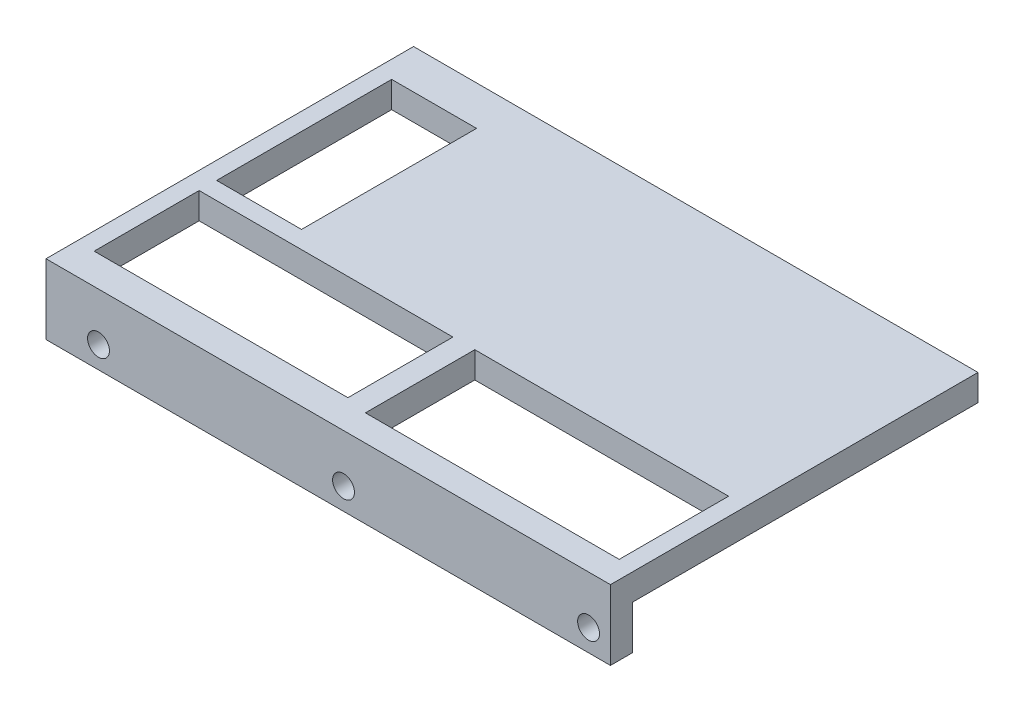
ISO-10303-21;
HEADER;
FILE_DESCRIPTION(('STEP AP214'),'2;1');
FILE_NAME('part.step','',(''),(''),'','','');
FILE_SCHEMA(('AUTOMOTIVE_DESIGN { 1 0 10303 214 1 1 1 1 }'));
ENDSEC;
DATA;
#1=APPLICATION_CONTEXT('core data for automotive mechanical design processes');
#2=APPLICATION_PROTOCOL_DEFINITION('international standard','automotive_design',2000,#1);
#3=PRODUCT_CONTEXT('',#1,'mechanical');
#4=PRODUCT('Part','Part','',(#3));
#5=PRODUCT_RELATED_PRODUCT_CATEGORY('part','',(#4));
#6=PRODUCT_DEFINITION_FORMATION('','',#4);
#7=PRODUCT_DEFINITION_CONTEXT('part definition',#1,'design');
#8=PRODUCT_DEFINITION('design','',#6,#7);
#9=PRODUCT_DEFINITION_SHAPE('','',#8);
#10=(LENGTH_UNIT() NAMED_UNIT(*) SI_UNIT(.MILLI.,.METRE.));
#11=(NAMED_UNIT(*) PLANE_ANGLE_UNIT() SI_UNIT($,.RADIAN.));
#12=(NAMED_UNIT(*) SI_UNIT($,.STERADIAN.) SOLID_ANGLE_UNIT());
#13=UNCERTAINTY_MEASURE_WITH_UNIT(LENGTH_MEASURE(1.E-05),#10,'distance_accuracy_value','');
#14=(GEOMETRIC_REPRESENTATION_CONTEXT(3) GLOBAL_UNCERTAINTY_ASSIGNED_CONTEXT((#13)) GLOBAL_UNIT_ASSIGNED_CONTEXT((#10,
#11,#12)) REPRESENTATION_CONTEXT('',''));
#15=CARTESIAN_POINT('',(0.,0.,0.));
#16=DIRECTION('',(0.,0.,1.));
#17=DIRECTION('',(1.,0.,0.));
#18=AXIS2_PLACEMENT_3D('',#15,#16,#17);
#19=CARTESIAN_POINT('',(0.,3.,0.));
#20=DIRECTION('',(1.,0.,0.));
#21=DIRECTION('',(0.,0.,-1.));
#22=AXIS2_PLACEMENT_3D('',#19,#20,#21);
#23=PLANE('',#22);
#24=DIRECTION('',(0.,0.,1.));
#25=VECTOR('',#24,1.);
#26=CARTESIAN_POINT('',(0.,0.,0.));
#27=LINE('',#26,#25);
#28=CARTESIAN_POINT('',(0.,0.,-42.));
#29=VERTEX_POINT('',#28);
#30=CARTESIAN_POINT('',(0.,0.,-2.5));
#31=VERTEX_POINT('',#30);
#32=EDGE_CURVE('E180',#29,#31,#27,.T.);
#33=ORIENTED_EDGE('',*,*,#32,.T.);
#34=DIRECTION('',(0.,1.,0.));
#35=VECTOR('',#34,1.);
#36=CARTESIAN_POINT('',(0.,-5.,-2.5));
#37=LINE('',#36,#35);
#38=CARTESIAN_POINT('',(0.,-5.,-2.5));
#39=VERTEX_POINT('',#38);
#40=EDGE_CURVE('E162',#39,#31,#37,.T.);
#41=ORIENTED_EDGE('',*,*,#40,.F.);
#42=DIRECTION('',(0.,0.,-1.));
#43=VECTOR('',#42,1.);
#44=CARTESIAN_POINT('',(0.,-5.,0.));
#45=LINE('',#44,#43);
#46=CARTESIAN_POINT('',(0.,-5.,0.));
#47=VERTEX_POINT('',#46);
#48=EDGE_CURVE('E169',#47,#39,#45,.T.);
#49=ORIENTED_EDGE('',*,*,#48,.F.);
#50=DIRECTION('',(0.,-1.,0.));
#51=VECTOR('',#50,1.);
#52=CARTESIAN_POINT('',(0.,3.,0.));
#53=LINE('',#52,#51);
#54=CARTESIAN_POINT('',(0.,3.,0.));
#55=VERTEX_POINT('',#54);
#56=EDGE_CURVE('E11',#55,#47,#53,.T.);
#57=ORIENTED_EDGE('',*,*,#56,.F.);
#58=DIRECTION('',(0.,0.,1.));
#59=VECTOR('',#58,1.);
#60=CARTESIAN_POINT('',(0.,3.,0.));
#61=LINE('',#60,#59);
#62=CARTESIAN_POINT('',(0.,3.,-42.));
#63=VERTEX_POINT('',#62);
#64=EDGE_CURVE('E279',#63,#55,#61,.T.);
#65=ORIENTED_EDGE('',*,*,#64,.F.);
#66=DIRECTION('',(0.,-1.,0.));
#67=VECTOR('',#66,1.);
#68=CARTESIAN_POINT('',(0.,3.,-42.));
#69=LINE('',#68,#67);
#70=EDGE_CURVE('E289',#63,#29,#69,.T.);
#71=ORIENTED_EDGE('',*,*,#70,.T.);
#72=EDGE_LOOP('',(#33,#41,#49,#57,#65,#71));
#73=FACE_BOUND('',#72,.T.);
#74=ADVANCED_FACE('F33',(#73),#23,.F.);
#75=CARTESIAN_POINT('',(0.,3.,0.));
#76=DIRECTION('',(0.,0.,-1.));
#77=DIRECTION('',(-1.,0.,0.));
#78=AXIS2_PLACEMENT_3D('',#75,#76,#77);
#79=PLANE('',#78);
#80=CARTESIAN_POINT('',(62.,-2.5,0.));
#81=DIRECTION('',(0.,0.,1.));
#82=DIRECTION('',(1.,0.,0.));
#83=AXIS2_PLACEMENT_3D('',#80,#81,#82);
#84=CIRCLE('',#83,1.25);
#85=CARTESIAN_POINT('',(63.25,-2.5,0.));
#86=VERTEX_POINT('',#85);
#87=EDGE_CURVE('E308',#86,#86,#84,.T.);
#88=ORIENTED_EDGE('',*,*,#87,.F.);
#89=EDGE_LOOP('',(#88));
#90=FACE_BOUND('',#89,.T.);
#91=CARTESIAN_POINT('',(6.,-2.5,0.));
#92=DIRECTION('',(0.,0.,1.));
#93=DIRECTION('',(1.,0.,0.));
#94=AXIS2_PLACEMENT_3D('',#91,#92,#93);
#95=CIRCLE('',#94,1.25);
#96=CARTESIAN_POINT('',(7.25,-2.5,0.));
#97=VERTEX_POINT('',#96);
#98=EDGE_CURVE('E316',#97,#97,#95,.T.);
#99=ORIENTED_EDGE('',*,*,#98,.F.);
#100=EDGE_LOOP('',(#99));
#101=FACE_BOUND('',#100,.T.);
#102=CARTESIAN_POINT('',(34.,-2.5,0.));
#103=DIRECTION('',(0.,0.,1.));
#104=DIRECTION('',(1.,0.,0.));
#105=AXIS2_PLACEMENT_3D('',#102,#103,#104);
#106=CIRCLE('',#105,1.25);
#107=CARTESIAN_POINT('',(35.25,-2.5,0.));
#108=VERTEX_POINT('',#107);
#109=EDGE_CURVE('E322',#108,#108,#106,.T.);
#110=ORIENTED_EDGE('',*,*,#109,.F.);
#111=EDGE_LOOP('',(#110));
#112=FACE_BOUND('',#111,.T.);
#113=ORIENTED_EDGE('',*,*,#56,.T.);
#114=DIRECTION('',(-1.,0.,0.));
#115=VECTOR('',#114,1.);
#116=CARTESIAN_POINT('',(0.,-5.,0.));
#117=LINE('',#116,#115);
#118=CARTESIAN_POINT('',(64.5,-5.,0.));
#119=VERTEX_POINT('',#118);
#120=EDGE_CURVE('E175',#119,#47,#117,.T.);
#121=ORIENTED_EDGE('',*,*,#120,.F.);
#122=DIRECTION('',(0.,-1.,0.));
#123=VECTOR('',#122,1.);
#124=CARTESIAN_POINT('',(64.5,3.,0.));
#125=LINE('',#124,#123);
#126=CARTESIAN_POINT('',(64.5,3.,0.));
#127=VERTEX_POINT('',#126);
#128=EDGE_CURVE('E40',#127,#119,#125,.T.);
#129=ORIENTED_EDGE('',*,*,#128,.F.);
#130=DIRECTION('',(1.,0.,0.));
#131=VECTOR('',#130,1.);
#132=CARTESIAN_POINT('',(0.,3.,0.));
#133=LINE('',#132,#131);
#134=EDGE_CURVE('E282',#55,#127,#133,.T.);
#135=ORIENTED_EDGE('',*,*,#134,.F.);
#136=EDGE_LOOP('',(#113,#121,#129,#135));
#137=FACE_BOUND('',#136,.T.);
#138=ADVANCED_FACE('F304',(#90,#101,#112,#137),#79,.F.);
#139=CARTESIAN_POINT('',(64.5,3.,0.));
#140=DIRECTION('',(-1.,0.,0.));
#141=DIRECTION('',(0.,0.,1.));
#142=AXIS2_PLACEMENT_3D('',#139,#140,#141);
#143=PLANE('',#142);
#144=ORIENTED_EDGE('',*,*,#128,.T.);
#145=DIRECTION('',(0.,0.,1.));
#146=VECTOR('',#145,1.);
#147=CARTESIAN_POINT('',(64.5,-5.,0.));
#148=LINE('',#147,#146);
#149=CARTESIAN_POINT('',(64.5,-5.,-2.5));
#150=VERTEX_POINT('',#149);
#151=EDGE_CURVE('E168',#150,#119,#148,.T.);
#152=ORIENTED_EDGE('',*,*,#151,.F.);
#153=DIRECTION('',(0.,1.,0.));
#154=VECTOR('',#153,1.);
#155=CARTESIAN_POINT('',(64.5,-5.,-2.5));
#156=LINE('',#155,#154);
#157=CARTESIAN_POINT('',(64.5,0.,-2.5));
#158=VERTEX_POINT('',#157);
#159=EDGE_CURVE('E164',#150,#158,#156,.T.);
#160=ORIENTED_EDGE('',*,*,#159,.T.);
#161=DIRECTION('',(0.,0.,-1.));
#162=VECTOR('',#161,1.);
#163=CARTESIAN_POINT('',(64.5,0.,0.));
#164=LINE('',#163,#162);
#165=CARTESIAN_POINT('',(64.5,0.,-42.));
#166=VERTEX_POINT('',#165);
#167=EDGE_CURVE('E291',#158,#166,#164,.T.);
#168=ORIENTED_EDGE('',*,*,#167,.T.);
#169=DIRECTION('',(0.,-1.,0.));
#170=VECTOR('',#169,1.);
#171=CARTESIAN_POINT('',(64.5,3.,-42.));
#172=LINE('',#171,#170);
#173=CARTESIAN_POINT('',(64.5,3.,-42.));
#174=VERTEX_POINT('',#173);
#175=EDGE_CURVE('E295',#174,#166,#172,.T.);
#176=ORIENTED_EDGE('',*,*,#175,.F.);
#177=DIRECTION('',(0.,0.,-1.));
#178=VECTOR('',#177,1.);
#179=CARTESIAN_POINT('',(64.5,3.,0.));
#180=LINE('',#179,#178);
#181=EDGE_CURVE('E285',#127,#174,#180,.T.);
#182=ORIENTED_EDGE('',*,*,#181,.F.);
#183=EDGE_LOOP('',(#144,#152,#160,#168,#176,#182));
#184=FACE_BOUND('',#183,.T.);
#185=ADVANCED_FACE('F300',(#184),#143,.F.);
#186=CARTESIAN_POINT('',(0.,3.,-42.));
#187=DIRECTION('',(0.,0.,1.));
#188=DIRECTION('',(1.,0.,0.));
#189=AXIS2_PLACEMENT_3D('',#186,#187,#188);
#190=PLANE('',#189);
#191=DIRECTION('',(-1.,0.,0.));
#192=VECTOR('',#191,1.);
#193=CARTESIAN_POINT('',(0.,0.,-42.));
#194=LINE('',#193,#192);
#195=EDGE_CURVE('E283',#166,#29,#194,.T.);
#196=ORIENTED_EDGE('',*,*,#195,.T.);
#197=ORIENTED_EDGE('',*,*,#70,.F.);
#198=DIRECTION('',(-1.,0.,0.));
#199=VECTOR('',#198,1.);
#200=CARTESIAN_POINT('',(0.,3.,-42.));
#201=LINE('',#200,#199);
#202=EDGE_CURVE('E287',#174,#63,#201,.T.);
#203=ORIENTED_EDGE('',*,*,#202,.F.);
#204=ORIENTED_EDGE('',*,*,#175,.T.);
#205=EDGE_LOOP('',(#196,#197,#203,#204));
#206=FACE_BOUND('',#205,.T.);
#207=ADVANCED_FACE('F352',(#206),#190,.F.);
#208=CARTESIAN_POINT('',(0.,3.,0.));
#209=DIRECTION('',(0.,-1.,0.));
#210=DIRECTION('',(0.,0.,-1.));
#211=AXIS2_PLACEMENT_3D('',#208,#209,#210);
#212=PLANE('',#211);
#213=DIRECTION('',(-1.,0.,0.));
#214=VECTOR('',#213,1.);
#215=CARTESIAN_POINT('',(62.5,3.,-15.5));
#216=LINE('',#215,#214);
#217=CARTESIAN_POINT('',(62.5,3.,-15.5));
#218=VERTEX_POINT('',#217);
#219=CARTESIAN_POINT('',(33.5,3.,-15.5));
#220=VERTEX_POINT('',#219);
#221=EDGE_CURVE('E200',#218,#220,#216,.T.);
#222=ORIENTED_EDGE('',*,*,#221,.F.);
#223=DIRECTION('',(0.,0.,-1.));
#224=VECTOR('',#223,1.);
#225=CARTESIAN_POINT('',(62.5,3.,-3.00000000000001));
#226=LINE('',#225,#224);
#227=CARTESIAN_POINT('',(62.5,3.,-3.00000000000001));
#228=VERTEX_POINT('',#227);
#229=EDGE_CURVE('E55',#228,#218,#226,.T.);
#230=ORIENTED_EDGE('',*,*,#229,.F.);
#231=DIRECTION('',(1.,0.,0.));
#232=VECTOR('',#231,1.);
#233=CARTESIAN_POINT('',(62.5,3.,-3.00000000000001));
#234=LINE('',#233,#232);
#235=CARTESIAN_POINT('',(33.5,3.,-3.));
#236=VERTEX_POINT('',#235);
#237=EDGE_CURVE('E206',#236,#228,#234,.T.);
#238=ORIENTED_EDGE('',*,*,#237,.F.);
#239=DIRECTION('',(0.,0.,1.));
#240=VECTOR('',#239,1.);
#241=CARTESIAN_POINT('',(33.5,3.,-3.));
#242=LINE('',#241,#240);
#243=EDGE_CURVE('E203',#220,#236,#242,.T.);
#244=ORIENTED_EDGE('',*,*,#243,.F.);
#245=EDGE_LOOP('',(#222,#230,#238,#244));
#246=FACE_BOUND('',#245,.T.);
#247=DIRECTION('',(-1.,0.,0.));
#248=VECTOR('',#247,1.);
#249=CARTESIAN_POINT('',(31.,3.,-15.5));
#250=LINE('',#249,#248);
#251=CARTESIAN_POINT('',(31.,3.,-15.5));
#252=VERTEX_POINT('',#251);
#253=CARTESIAN_POINT('',(1.99999999999995,3.,-15.5));
#254=VERTEX_POINT('',#253);
#255=EDGE_CURVE('E232',#252,#254,#250,.T.);
#256=ORIENTED_EDGE('',*,*,#255,.F.);
#257=DIRECTION('',(0.,0.,-1.));
#258=VECTOR('',#257,1.);
#259=CARTESIAN_POINT('',(31.,3.,-3.5));
#260=LINE('',#259,#258);
#261=CARTESIAN_POINT('',(31.,3.,-3.5));
#262=VERTEX_POINT('',#261);
#263=EDGE_CURVE('E230',#262,#252,#260,.T.);
#264=ORIENTED_EDGE('',*,*,#263,.F.);
#265=DIRECTION('',(1.,0.,0.));
#266=VECTOR('',#265,1.);
#267=CARTESIAN_POINT('',(31.,3.,-3.5));
#268=LINE('',#267,#266);
#269=CARTESIAN_POINT('',(1.99999999999995,3.,-3.5));
#270=VERTEX_POINT('',#269);
#271=EDGE_CURVE('E238',#270,#262,#268,.T.);
#272=ORIENTED_EDGE('',*,*,#271,.F.);
#273=DIRECTION('',(0.,0.,1.));
#274=VECTOR('',#273,1.);
#275=CARTESIAN_POINT('',(1.99999999999995,3.,-3.5));
#276=LINE('',#275,#274);
#277=EDGE_CURVE('E235',#254,#270,#276,.T.);
#278=ORIENTED_EDGE('',*,*,#277,.F.);
#279=EDGE_LOOP('',(#256,#264,#272,#278));
#280=FACE_BOUND('',#279,.T.);
#281=DIRECTION('',(-1.,0.,0.));
#282=VECTOR('',#281,1.);
#283=CARTESIAN_POINT('',(11.7,3.,-37.5));
#284=LINE('',#283,#282);
#285=CARTESIAN_POINT('',(11.7,3.,-37.5));
#286=VERTEX_POINT('',#285);
#287=CARTESIAN_POINT('',(1.99999999999994,3.,-37.5));
#288=VERTEX_POINT('',#287);
#289=EDGE_CURVE('E259',#286,#288,#284,.T.);
#290=ORIENTED_EDGE('',*,*,#289,.F.);
#291=DIRECTION('',(0.,0.,-1.));
#292=VECTOR('',#291,1.);
#293=CARTESIAN_POINT('',(11.7,3.,-17.5));
#294=LINE('',#293,#292);
#295=CARTESIAN_POINT('',(11.7,3.,-17.5));
#296=VERTEX_POINT('',#295);
#297=EDGE_CURVE('E257',#296,#286,#294,.T.);
#298=ORIENTED_EDGE('',*,*,#297,.F.);
#299=DIRECTION('',(1.,0.,0.));
#300=VECTOR('',#299,1.);
#301=CARTESIAN_POINT('',(11.7,3.,-17.5));
#302=LINE('',#301,#300);
#303=CARTESIAN_POINT('',(1.99999999999995,3.,-17.5));
#304=VERTEX_POINT('',#303);
#305=EDGE_CURVE('E265',#304,#296,#302,.T.);
#306=ORIENTED_EDGE('',*,*,#305,.F.);
#307=DIRECTION('',(0.,0.,1.));
#308=VECTOR('',#307,1.);
#309=CARTESIAN_POINT('',(1.99999999999995,3.,-17.5));
#310=LINE('',#309,#308);
#311=EDGE_CURVE('E262',#288,#304,#310,.T.);
#312=ORIENTED_EDGE('',*,*,#311,.F.);
#313=EDGE_LOOP('',(#290,#298,#306,#312));
#314=FACE_BOUND('',#313,.T.);
#315=ORIENTED_EDGE('',*,*,#64,.T.);
#316=ORIENTED_EDGE('',*,*,#134,.T.);
#317=ORIENTED_EDGE('',*,*,#181,.T.);
#318=ORIENTED_EDGE('',*,*,#202,.T.);
#319=EDGE_LOOP('',(#315,#316,#317,#318));
#320=FACE_BOUND('',#319,.T.);
#321=ADVANCED_FACE('F359',(#246,#280,#314,#320),#212,.F.);
#322=CARTESIAN_POINT('',(0.,0.,0.));
#323=DIRECTION('',(0.,-1.,0.));
#324=DIRECTION('',(0.,0.,-1.));
#325=AXIS2_PLACEMENT_3D('',#322,#323,#324);
#326=PLANE('',#325);
#327=DIRECTION('',(1.,0.,0.));
#328=VECTOR('',#327,1.);
#329=CARTESIAN_POINT('',(0.,0.,-2.5));
#330=LINE('',#329,#328);
#331=EDGE_CURVE('E47',#31,#158,#330,.T.);
#332=ORIENTED_EDGE('',*,*,#331,.F.);
#333=ORIENTED_EDGE('',*,*,#32,.F.);
#334=ORIENTED_EDGE('',*,*,#195,.F.);
#335=ORIENTED_EDGE('',*,*,#167,.F.);
#336=EDGE_LOOP('',(#332,#333,#334,#335));
#337=FACE_BOUND('',#336,.T.);
#338=DIRECTION('',(0.,0.,-1.));
#339=VECTOR('',#338,1.);
#340=CARTESIAN_POINT('',(62.5,0.,-3.00000000000001));
#341=LINE('',#340,#339);
#342=CARTESIAN_POINT('',(62.5,0.,-3.00000000000001));
#343=VERTEX_POINT('',#342);
#344=CARTESIAN_POINT('',(62.5,0.,-15.5));
#345=VERTEX_POINT('',#344);
#346=EDGE_CURVE('E196',#343,#345,#341,.T.);
#347=ORIENTED_EDGE('',*,*,#346,.T.);
#348=DIRECTION('',(-1.,0.,0.));
#349=VECTOR('',#348,1.);
#350=CARTESIAN_POINT('',(62.5,0.,-15.5));
#351=LINE('',#350,#349);
#352=CARTESIAN_POINT('',(33.5,0.,-15.5));
#353=VERTEX_POINT('',#352);
#354=EDGE_CURVE('E212',#345,#353,#351,.T.);
#355=ORIENTED_EDGE('',*,*,#354,.T.);
#356=DIRECTION('',(0.,0.,1.));
#357=VECTOR('',#356,1.);
#358=CARTESIAN_POINT('',(33.5,0.,-3.));
#359=LINE('',#358,#357);
#360=CARTESIAN_POINT('',(33.5,0.,-3.));
#361=VERTEX_POINT('',#360);
#362=EDGE_CURVE('E189',#353,#361,#359,.T.);
#363=ORIENTED_EDGE('',*,*,#362,.T.);
#364=DIRECTION('',(1.,0.,0.));
#365=VECTOR('',#364,1.);
#366=CARTESIAN_POINT('',(62.5,0.,-3.00000000000001));
#367=LINE('',#366,#365);
#368=EDGE_CURVE('E192',#361,#343,#367,.T.);
#369=ORIENTED_EDGE('',*,*,#368,.T.);
#370=EDGE_LOOP('',(#347,#355,#363,#369));
#371=FACE_BOUND('',#370,.T.);
#372=DIRECTION('',(0.,0.,-1.));
#373=VECTOR('',#372,1.);
#374=CARTESIAN_POINT('',(31.,0.,-3.5));
#375=LINE('',#374,#373);
#376=CARTESIAN_POINT('',(31.,0.,-3.5));
#377=VERTEX_POINT('',#376);
#378=CARTESIAN_POINT('',(31.,0.,-15.5));
#379=VERTEX_POINT('',#378);
#380=EDGE_CURVE('E227',#377,#379,#375,.T.);
#381=ORIENTED_EDGE('',*,*,#380,.T.);
#382=DIRECTION('',(-1.,0.,0.));
#383=VECTOR('',#382,1.);
#384=CARTESIAN_POINT('',(31.,0.,-15.5));
#385=LINE('',#384,#383);
#386=CARTESIAN_POINT('',(1.99999999999995,0.,-15.5));
#387=VERTEX_POINT('',#386);
#388=EDGE_CURVE('E193',#379,#387,#385,.T.);
#389=ORIENTED_EDGE('',*,*,#388,.T.);
#390=DIRECTION('',(0.,0.,1.));
#391=VECTOR('',#390,1.);
#392=CARTESIAN_POINT('',(1.99999999999995,0.,-3.5));
#393=LINE('',#392,#391);
#394=CARTESIAN_POINT('',(1.99999999999995,0.,-3.5));
#395=VERTEX_POINT('',#394);
#396=EDGE_CURVE('E220',#387,#395,#393,.T.);
#397=ORIENTED_EDGE('',*,*,#396,.T.);
#398=DIRECTION('',(1.,0.,0.));
#399=VECTOR('',#398,1.);
#400=CARTESIAN_POINT('',(31.,0.,-3.5));
#401=LINE('',#400,#399);
#402=EDGE_CURVE('E223',#395,#377,#401,.T.);
#403=ORIENTED_EDGE('',*,*,#402,.T.);
#404=EDGE_LOOP('',(#381,#389,#397,#403));
#405=FACE_BOUND('',#404,.T.);
#406=DIRECTION('',(0.,0.,-1.));
#407=VECTOR('',#406,1.);
#408=CARTESIAN_POINT('',(11.7,0.,-17.5));
#409=LINE('',#408,#407);
#410=CARTESIAN_POINT('',(11.7,0.,-17.5));
#411=VERTEX_POINT('',#410);
#412=CARTESIAN_POINT('',(11.7,0.,-37.5));
#413=VERTEX_POINT('',#412);
#414=EDGE_CURVE('E254',#411,#413,#409,.T.);
#415=ORIENTED_EDGE('',*,*,#414,.T.);
#416=DIRECTION('',(-1.,0.,0.));
#417=VECTOR('',#416,1.);
#418=CARTESIAN_POINT('',(11.7,0.,-37.5));
#419=LINE('',#418,#417);
#420=CARTESIAN_POINT('',(1.99999999999994,0.,-37.5));
#421=VERTEX_POINT('',#420);
#422=EDGE_CURVE('E224',#413,#421,#419,.T.);
#423=ORIENTED_EDGE('',*,*,#422,.T.);
#424=DIRECTION('',(0.,0.,1.));
#425=VECTOR('',#424,1.);
#426=CARTESIAN_POINT('',(1.99999999999995,0.,-17.5));
#427=LINE('',#426,#425);
#428=CARTESIAN_POINT('',(1.99999999999995,0.,-17.5));
#429=VERTEX_POINT('',#428);
#430=EDGE_CURVE('E181',#421,#429,#427,.T.);
#431=ORIENTED_EDGE('',*,*,#430,.T.);
#432=DIRECTION('',(1.,0.,0.));
#433=VECTOR('',#432,1.);
#434=CARTESIAN_POINT('',(11.7,0.,-17.5));
#435=LINE('',#434,#433);
#436=EDGE_CURVE('E184',#429,#411,#435,.T.);
#437=ORIENTED_EDGE('',*,*,#436,.T.);
#438=EDGE_LOOP('',(#415,#423,#431,#437));
#439=FACE_BOUND('',#438,.T.);
#440=ADVANCED_FACE('F361',(#337,#371,#405,#439),#326,.T.);
#441=CARTESIAN_POINT('',(11.7,-0.00100000000000013,-17.5));
#442=DIRECTION('',(1.,0.,0.));
#443=DIRECTION('',(0.,0.,-1.));
#444=AXIS2_PLACEMENT_3D('',#441,#442,#443);
#445=PLANE('',#444);
#446=DIRECTION('',(0.,1.,0.));
#447=VECTOR('',#446,1.);
#448=CARTESIAN_POINT('',(11.7,-0.00100000000000013,-17.5));
#449=LINE('',#448,#447);
#450=EDGE_CURVE('E269',#411,#296,#449,.T.);
#451=ORIENTED_EDGE('',*,*,#450,.T.);
#452=ORIENTED_EDGE('',*,*,#297,.T.);
#453=DIRECTION('',(0.,1.,0.));
#454=VECTOR('',#453,1.);
#455=CARTESIAN_POINT('',(11.7,-0.00100000000000013,-37.5));
#456=LINE('',#455,#454);
#457=EDGE_CURVE('E268',#413,#286,#456,.T.);
#458=ORIENTED_EDGE('',*,*,#457,.F.);
#459=ORIENTED_EDGE('',*,*,#414,.F.);
#460=EDGE_LOOP('',(#451,#452,#458,#459));
#461=FACE_BOUND('',#460,.T.);
#462=ADVANCED_FACE('F364',(#461),#445,.F.);
#463=CARTESIAN_POINT('',(11.7,-0.00100000000000013,-17.5));
#464=DIRECTION('',(0.,0.,1.));
#465=DIRECTION('',(1.,0.,0.));
#466=AXIS2_PLACEMENT_3D('',#463,#464,#465);
#467=PLANE('',#466);
#468=DIRECTION('',(0.,1.,0.));
#469=VECTOR('',#468,1.);
#470=CARTESIAN_POINT('',(1.99999999999995,-0.00100000000000013,-17.5));
#471=LINE('',#470,#469);
#472=EDGE_CURVE('E271',#429,#304,#471,.T.);
#473=ORIENTED_EDGE('',*,*,#472,.T.);
#474=ORIENTED_EDGE('',*,*,#305,.T.);
#475=ORIENTED_EDGE('',*,*,#450,.F.);
#476=ORIENTED_EDGE('',*,*,#436,.F.);
#477=EDGE_LOOP('',(#473,#474,#475,#476));
#478=FACE_BOUND('',#477,.T.);
#479=ADVANCED_FACE('F370',(#478),#467,.F.);
#480=CARTESIAN_POINT('',(1.99999999999995,-0.00100000000000013,-17.5));
#481=DIRECTION('',(-1.,0.,0.));
#482=DIRECTION('',(0.,0.,1.));
#483=AXIS2_PLACEMENT_3D('',#480,#481,#482);
#484=PLANE('',#483);
#485=DIRECTION('',(0.,1.,0.));
#486=VECTOR('',#485,1.);
#487=CARTESIAN_POINT('',(1.99999999999994,-0.00100000000000013,-37.5));
#488=LINE('',#487,#486);
#489=EDGE_CURVE('E273',#421,#288,#488,.T.);
#490=ORIENTED_EDGE('',*,*,#489,.T.);
#491=ORIENTED_EDGE('',*,*,#311,.T.);
#492=ORIENTED_EDGE('',*,*,#472,.F.);
#493=ORIENTED_EDGE('',*,*,#430,.F.);
#494=EDGE_LOOP('',(#490,#491,#492,#493));
#495=FACE_BOUND('',#494,.T.);
#496=ADVANCED_FACE('F376',(#495),#484,.F.);
#497=CARTESIAN_POINT('',(11.7,-0.00100000000000013,-37.5));
#498=DIRECTION('',(0.,0.,-1.));
#499=DIRECTION('',(-1.,0.,0.));
#500=AXIS2_PLACEMENT_3D('',#497,#498,#499);
#501=PLANE('',#500);
#502=ORIENTED_EDGE('',*,*,#457,.T.);
#503=ORIENTED_EDGE('',*,*,#289,.T.);
#504=ORIENTED_EDGE('',*,*,#489,.F.);
#505=ORIENTED_EDGE('',*,*,#422,.F.);
#506=EDGE_LOOP('',(#502,#503,#504,#505));
#507=FACE_BOUND('',#506,.T.);
#508=ADVANCED_FACE('F372',(#507),#501,.F.);
#509=CARTESIAN_POINT('',(31.,-0.00100000000000013,-3.5));
#510=DIRECTION('',(1.,0.,0.));
#511=DIRECTION('',(0.,0.,-1.));
#512=AXIS2_PLACEMENT_3D('',#509,#510,#511);
#513=PLANE('',#512);
#514=DIRECTION('',(0.,1.,0.));
#515=VECTOR('',#514,1.);
#516=CARTESIAN_POINT('',(31.,-0.00100000000000013,-3.5));
#517=LINE('',#516,#515);
#518=EDGE_CURVE('E242',#377,#262,#517,.T.);
#519=ORIENTED_EDGE('',*,*,#518,.T.);
#520=ORIENTED_EDGE('',*,*,#263,.T.);
#521=DIRECTION('',(0.,1.,0.));
#522=VECTOR('',#521,1.);
#523=CARTESIAN_POINT('',(31.,-0.00100000000000013,-15.5));
#524=LINE('',#523,#522);
#525=EDGE_CURVE('E241',#379,#252,#524,.T.);
#526=ORIENTED_EDGE('',*,*,#525,.F.);
#527=ORIENTED_EDGE('',*,*,#380,.F.);
#528=EDGE_LOOP('',(#519,#520,#526,#527));
#529=FACE_BOUND('',#528,.T.);
#530=ADVANCED_FACE('F375',(#529),#513,.F.);
#531=CARTESIAN_POINT('',(31.,-0.00100000000000013,-3.5));
#532=DIRECTION('',(0.,0.,1.));
#533=DIRECTION('',(1.,0.,0.));
#534=AXIS2_PLACEMENT_3D('',#531,#532,#533);
#535=PLANE('',#534);
#536=DIRECTION('',(0.,1.,0.));
#537=VECTOR('',#536,1.);
#538=CARTESIAN_POINT('',(1.99999999999995,-0.00100000000000013,-3.5));
#539=LINE('',#538,#537);
#540=EDGE_CURVE('E244',#395,#270,#539,.T.);
#541=ORIENTED_EDGE('',*,*,#540,.T.);
#542=ORIENTED_EDGE('',*,*,#271,.T.);
#543=ORIENTED_EDGE('',*,*,#518,.F.);
#544=ORIENTED_EDGE('',*,*,#402,.F.);
#545=EDGE_LOOP('',(#541,#542,#543,#544));
#546=FACE_BOUND('',#545,.T.);
#547=ADVANCED_FACE('F386',(#546),#535,.F.);
#548=CARTESIAN_POINT('',(1.99999999999995,-0.00100000000000013,-3.5));
#549=DIRECTION('',(-1.,0.,0.));
#550=DIRECTION('',(0.,0.,1.));
#551=AXIS2_PLACEMENT_3D('',#548,#549,#550);
#552=PLANE('',#551);
#553=DIRECTION('',(0.,1.,0.));
#554=VECTOR('',#553,1.);
#555=CARTESIAN_POINT('',(1.99999999999995,-0.00100000000000013,-15.5));
#556=LINE('',#555,#554);
#557=EDGE_CURVE('E246',#387,#254,#556,.T.);
#558=ORIENTED_EDGE('',*,*,#557,.T.);
#559=ORIENTED_EDGE('',*,*,#277,.T.);
#560=ORIENTED_EDGE('',*,*,#540,.F.);
#561=ORIENTED_EDGE('',*,*,#396,.F.);
#562=EDGE_LOOP('',(#558,#559,#560,#561));
#563=FACE_BOUND('',#562,.T.);
#564=ADVANCED_FACE('F392',(#563),#552,.F.);
#565=CARTESIAN_POINT('',(31.,-0.00100000000000013,-15.5));
#566=DIRECTION('',(0.,0.,-1.));
#567=DIRECTION('',(-1.,0.,0.));
#568=AXIS2_PLACEMENT_3D('',#565,#566,#567);
#569=PLANE('',#568);
#570=ORIENTED_EDGE('',*,*,#525,.T.);
#571=ORIENTED_EDGE('',*,*,#255,.T.);
#572=ORIENTED_EDGE('',*,*,#557,.F.);
#573=ORIENTED_EDGE('',*,*,#388,.F.);
#574=EDGE_LOOP('',(#570,#571,#572,#573));
#575=FACE_BOUND('',#574,.T.);
#576=ADVANCED_FACE('F388',(#575),#569,.F.);
#577=CARTESIAN_POINT('',(62.5,-0.00100000000000013,-3.00000000000001));
#578=DIRECTION('',(1.,0.,0.));
#579=DIRECTION('',(0.,0.,-1.));
#580=AXIS2_PLACEMENT_3D('',#577,#578,#579);
#581=PLANE('',#580);
#582=DIRECTION('',(0.,1.,0.));
#583=VECTOR('',#582,1.);
#584=CARTESIAN_POINT('',(62.5,-0.00100000000000013,-3.00000000000001));
#585=LINE('',#584,#583);
#586=EDGE_CURVE('E210',#343,#228,#585,.T.);
#587=ORIENTED_EDGE('',*,*,#586,.T.);
#588=ORIENTED_EDGE('',*,*,#229,.T.);
#589=DIRECTION('',(0.,1.,0.));
#590=VECTOR('',#589,1.);
#591=CARTESIAN_POINT('',(62.5,-0.00100000000000013,-15.5));
#592=LINE('',#591,#590);
#593=EDGE_CURVE('E209',#345,#218,#592,.T.);
#594=ORIENTED_EDGE('',*,*,#593,.F.);
#595=ORIENTED_EDGE('',*,*,#346,.F.);
#596=EDGE_LOOP('',(#587,#588,#594,#595));
#597=FACE_BOUND('',#596,.T.);
#598=ADVANCED_FACE('F391',(#597),#581,.F.);
#599=CARTESIAN_POINT('',(62.5,-0.00100000000000013,-3.00000000000001));
#600=DIRECTION('',(0.,0.,1.));
#601=DIRECTION('',(1.,0.,0.));
#602=AXIS2_PLACEMENT_3D('',#599,#600,#601);
#603=PLANE('',#602);
#604=DIRECTION('',(0.,1.,0.));
#605=VECTOR('',#604,1.);
#606=CARTESIAN_POINT('',(33.5,-0.00100000000000013,-3.));
#607=LINE('',#606,#605);
#608=EDGE_CURVE('E213',#361,#236,#607,.T.);
#609=ORIENTED_EDGE('',*,*,#608,.T.);
#610=ORIENTED_EDGE('',*,*,#237,.T.);
#611=ORIENTED_EDGE('',*,*,#586,.F.);
#612=ORIENTED_EDGE('',*,*,#368,.F.);
#613=EDGE_LOOP('',(#609,#610,#611,#612));
#614=FACE_BOUND('',#613,.T.);
#615=ADVANCED_FACE('F401',(#614),#603,.F.);
#616=CARTESIAN_POINT('',(33.5,-0.00100000000000013,-3.));
#617=DIRECTION('',(-1.,0.,0.));
#618=DIRECTION('',(0.,0.,1.));
#619=AXIS2_PLACEMENT_3D('',#616,#617,#618);
#620=PLANE('',#619);
#621=DIRECTION('',(0.,1.,0.));
#622=VECTOR('',#621,1.);
#623=CARTESIAN_POINT('',(33.5,-0.00100000000000013,-15.5));
#624=LINE('',#623,#622);
#625=EDGE_CURVE('E215',#353,#220,#624,.T.);
#626=ORIENTED_EDGE('',*,*,#625,.T.);
#627=ORIENTED_EDGE('',*,*,#243,.T.);
#628=ORIENTED_EDGE('',*,*,#608,.F.);
#629=ORIENTED_EDGE('',*,*,#362,.F.);
#630=EDGE_LOOP('',(#626,#627,#628,#629));
#631=FACE_BOUND('',#630,.T.);
#632=ADVANCED_FACE('F339',(#631),#620,.F.);
#633=CARTESIAN_POINT('',(62.5,-0.00100000000000013,-15.5));
#634=DIRECTION('',(0.,0.,-1.));
#635=DIRECTION('',(-1.,0.,0.));
#636=AXIS2_PLACEMENT_3D('',#633,#634,#635);
#637=PLANE('',#636);
#638=ORIENTED_EDGE('',*,*,#593,.T.);
#639=ORIENTED_EDGE('',*,*,#221,.T.);
#640=ORIENTED_EDGE('',*,*,#625,.F.);
#641=ORIENTED_EDGE('',*,*,#354,.F.);
#642=EDGE_LOOP('',(#638,#639,#640,#641));
#643=FACE_BOUND('',#642,.T.);
#644=ADVANCED_FACE('F331',(#643),#637,.F.);
#645=CARTESIAN_POINT('',(0.,-5.,-2.5));
#646=DIRECTION('',(0.,0.,1.));
#647=DIRECTION('',(1.,0.,0.));
#648=AXIS2_PLACEMENT_3D('',#645,#646,#647);
#649=PLANE('',#648);
#650=CARTESIAN_POINT('',(62.,-2.5,-2.5));
#651=DIRECTION('',(0.,0.,1.));
#652=DIRECTION('',(1.,0.,0.));
#653=AXIS2_PLACEMENT_3D('',#650,#651,#652);
#654=CIRCLE('',#653,1.25);
#655=CARTESIAN_POINT('',(63.25,-2.5,-2.5));
#656=VERTEX_POINT('',#655);
#657=EDGE_CURVE('E306',#656,#656,#654,.F.);
#658=ORIENTED_EDGE('',*,*,#657,.F.);
#659=EDGE_LOOP('',(#658));
#660=FACE_BOUND('',#659,.T.);
#661=CARTESIAN_POINT('',(6.,-2.5,-2.5));
#662=DIRECTION('',(0.,0.,1.));
#663=DIRECTION('',(1.,0.,0.));
#664=AXIS2_PLACEMENT_3D('',#661,#662,#663);
#665=CIRCLE('',#664,1.25);
#666=CARTESIAN_POINT('',(7.25,-2.5,-2.5));
#667=VERTEX_POINT('',#666);
#668=EDGE_CURVE('E313',#667,#667,#665,.F.);
#669=ORIENTED_EDGE('',*,*,#668,.F.);
#670=EDGE_LOOP('',(#669));
#671=FACE_BOUND('',#670,.T.);
#672=CARTESIAN_POINT('',(34.,-2.5,-2.5));
#673=DIRECTION('',(0.,0.,1.));
#674=DIRECTION('',(1.,0.,0.));
#675=AXIS2_PLACEMENT_3D('',#672,#673,#674);
#676=CIRCLE('',#675,1.25);
#677=CARTESIAN_POINT('',(35.25,-2.5,-2.5));
#678=VERTEX_POINT('',#677);
#679=EDGE_CURVE('E319',#678,#678,#676,.F.);
#680=ORIENTED_EDGE('',*,*,#679,.F.);
#681=EDGE_LOOP('',(#680));
#682=FACE_BOUND('',#681,.T.);
#683=ORIENTED_EDGE('',*,*,#331,.T.);
#684=ORIENTED_EDGE('',*,*,#159,.F.);
#685=DIRECTION('',(1.,0.,0.));
#686=VECTOR('',#685,1.);
#687=CARTESIAN_POINT('',(0.,-5.,-2.5));
#688=LINE('',#687,#686);
#689=EDGE_CURVE('E158',#39,#150,#688,.T.);
#690=ORIENTED_EDGE('',*,*,#689,.F.);
#691=ORIENTED_EDGE('',*,*,#40,.T.);
#692=EDGE_LOOP('',(#683,#684,#690,#691));
#693=FACE_BOUND('',#692,.T.);
#694=ADVANCED_FACE('F160',(#660,#671,#682,#693),#649,.F.);
#695=CARTESIAN_POINT('',(0.,-5.,0.));
#696=DIRECTION('',(0.,-1.,0.));
#697=DIRECTION('',(0.,0.,-1.));
#698=AXIS2_PLACEMENT_3D('',#695,#696,#697);
#699=PLANE('',#698);
#700=ORIENTED_EDGE('',*,*,#48,.T.);
#701=ORIENTED_EDGE('',*,*,#689,.T.);
#702=ORIENTED_EDGE('',*,*,#151,.T.);
#703=ORIENTED_EDGE('',*,*,#120,.T.);
#704=EDGE_LOOP('',(#700,#701,#702,#703));
#705=FACE_BOUND('',#704,.T.);
#706=ADVANCED_FACE('F173',(#705),#699,.T.);
#707=CARTESIAN_POINT('',(34.,-2.5,-42.001));
#708=DIRECTION('',(0.,0.,1.));
#709=DIRECTION('',(1.,0.,0.));
#710=AXIS2_PLACEMENT_3D('',#707,#708,#709);
#711=CYLINDRICAL_SURFACE('',#710,1.25);
#712=ORIENTED_EDGE('',*,*,#109,.T.);
#713=EDGE_LOOP('',(#712));
#714=FACE_BOUND('',#713,.T.);
#715=ORIENTED_EDGE('',*,*,#679,.T.);
#716=EDGE_LOOP('',(#715));
#717=FACE_BOUND('',#716,.T.);
#718=ADVANCED_FACE('F328',(#714,#717),#711,.F.);
#719=CARTESIAN_POINT('',(6.,-2.5,-42.001));
#720=DIRECTION('',(0.,0.,1.));
#721=DIRECTION('',(1.,0.,0.));
#722=AXIS2_PLACEMENT_3D('',#719,#720,#721);
#723=CYLINDRICAL_SURFACE('',#722,1.25);
#724=ORIENTED_EDGE('',*,*,#98,.T.);
#725=EDGE_LOOP('',(#724));
#726=FACE_BOUND('',#725,.T.);
#727=ORIENTED_EDGE('',*,*,#668,.T.);
#728=EDGE_LOOP('',(#727));
#729=FACE_BOUND('',#728,.T.);
#730=ADVANCED_FACE('F495',(#726,#729),#723,.F.);
#731=CARTESIAN_POINT('',(62.,-2.5,-42.001));
#732=DIRECTION('',(0.,0.,1.));
#733=DIRECTION('',(1.,0.,0.));
#734=AXIS2_PLACEMENT_3D('',#731,#732,#733);
#735=CYLINDRICAL_SURFACE('',#734,1.25);
#736=ORIENTED_EDGE('',*,*,#87,.T.);
#737=EDGE_LOOP('',(#736));
#738=FACE_BOUND('',#737,.T.);
#739=ORIENTED_EDGE('',*,*,#657,.T.);
#740=EDGE_LOOP('',(#739));
#741=FACE_BOUND('',#740,.T.);
#742=ADVANCED_FACE('F505',(#738,#741),#735,.F.);
#743=CLOSED_SHELL('',(#74,#138,#185,#207,#321,#440,#462,#479,#496,#508,#530,#547,#564,#576,#598,
#615,#632,#644,#694,#706,#718,#730,#742));
#744=MANIFOLD_SOLID_BREP('B2',#743);
#745=ADVANCED_BREP_SHAPE_REPRESENTATION('',(#18,#744),#14);
#746=SHAPE_DEFINITION_REPRESENTATION(#9,#745);
ENDSEC;
END-ISO-10303-21;
